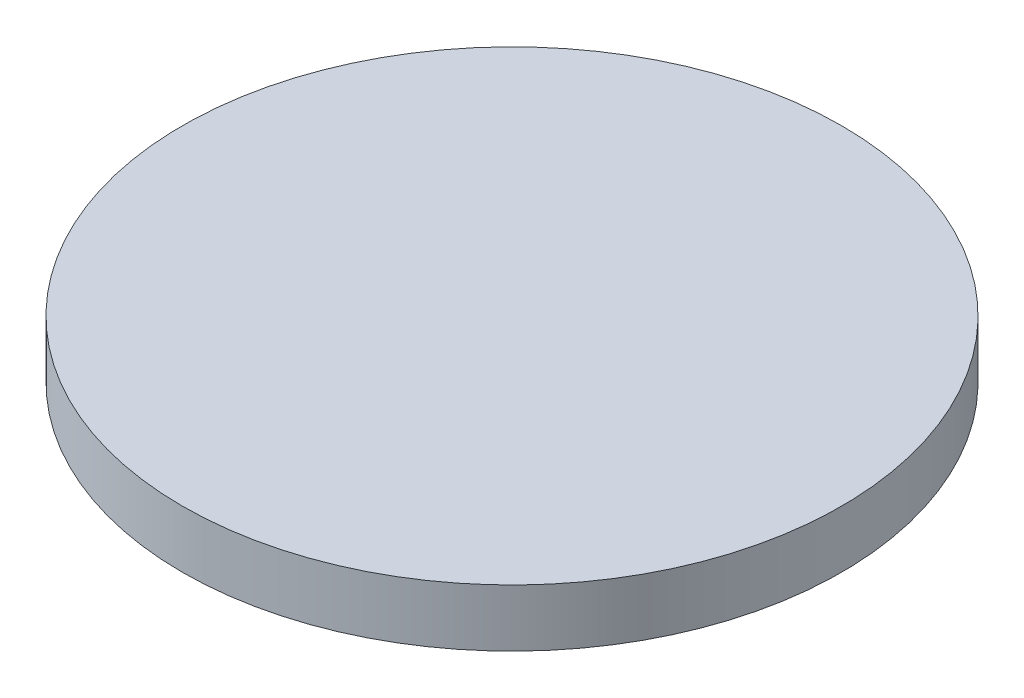
ISO-10303-21;
HEADER;
FILE_DESCRIPTION(('STEP AP214'),'2;1');
FILE_NAME('part.step','',(''),(''),'','','');
FILE_SCHEMA(('AUTOMOTIVE_DESIGN { 1 0 10303 214 1 1 1 1 }'));
ENDSEC;
DATA;
#1=APPLICATION_CONTEXT('core data for automotive mechanical design processes');
#2=APPLICATION_PROTOCOL_DEFINITION('international standard','automotive_design',2000,#1);
#3=PRODUCT_CONTEXT('',#1,'mechanical');
#4=PRODUCT('Part','Part','',(#3));
#5=PRODUCT_RELATED_PRODUCT_CATEGORY('part','',(#4));
#6=PRODUCT_DEFINITION_FORMATION('','',#4);
#7=PRODUCT_DEFINITION_CONTEXT('part definition',#1,'design');
#8=PRODUCT_DEFINITION('design','',#6,#7);
#9=PRODUCT_DEFINITION_SHAPE('','',#8);
#10=(LENGTH_UNIT() NAMED_UNIT(*) SI_UNIT(.MILLI.,.METRE.));
#11=(NAMED_UNIT(*) PLANE_ANGLE_UNIT() SI_UNIT($,.RADIAN.));
#12=(NAMED_UNIT(*) SI_UNIT($,.STERADIAN.) SOLID_ANGLE_UNIT());
#13=UNCERTAINTY_MEASURE_WITH_UNIT(LENGTH_MEASURE(1.E-05),#10,'distance_accuracy_value','');
#14=(GEOMETRIC_REPRESENTATION_CONTEXT(3) GLOBAL_UNCERTAINTY_ASSIGNED_CONTEXT((#13)) GLOBAL_UNIT_ASSIGNED_CONTEXT((#10,
#11,#12)) REPRESENTATION_CONTEXT('',''));
#15=CARTESIAN_POINT('',(0.,0.,0.));
#16=DIRECTION('',(0.,0.,1.));
#17=DIRECTION('',(1.,0.,0.));
#18=AXIS2_PLACEMENT_3D('',#15,#16,#17);
#19=CARTESIAN_POINT('',(0.,4.,0.));
#20=DIRECTION('',(0.,-1.,0.));
#21=DIRECTION('',(0.,0.,-1.));
#22=AXIS2_PLACEMENT_3D('',#19,#20,#21);
#23=CYLINDRICAL_SURFACE('',#22,23.);
#24=CARTESIAN_POINT('',(0.,4.,0.));
#25=DIRECTION('',(0.,1.,0.));
#26=DIRECTION('',(0.,0.,1.));
#27=AXIS2_PLACEMENT_3D('',#24,#25,#26);
#28=CIRCLE('',#27,23.);
#29=CARTESIAN_POINT('',(0.,4.,23.));
#30=VERTEX_POINT('',#29);
#31=EDGE_CURVE('E10',#30,#30,#28,.T.);
#32=ORIENTED_EDGE('',*,*,#31,.F.);
#33=EDGE_LOOP('',(#32));
#34=FACE_BOUND('',#33,.T.);
#35=CARTESIAN_POINT('',(0.,0.,0.));
#36=DIRECTION('',(0.,1.,0.));
#37=DIRECTION('',(0.,0.,1.));
#38=AXIS2_PLACEMENT_3D('',#35,#36,#37);
#39=CIRCLE('',#38,23.);
#40=CARTESIAN_POINT('',(0.,0.,23.));
#41=VERTEX_POINT('',#40);
#42=EDGE_CURVE('E36',#41,#41,#39,.T.);
#43=ORIENTED_EDGE('',*,*,#42,.T.);
#44=EDGE_LOOP('',(#43));
#45=FACE_BOUND('',#44,.T.);
#46=ADVANCED_FACE('F33',(#34,#45),#23,.T.);
#47=CARTESIAN_POINT('',(0.,4.,0.));
#48=DIRECTION('',(0.,1.,0.));
#49=DIRECTION('',(0.,0.,1.));
#50=AXIS2_PLACEMENT_3D('',#47,#48,#49);
#51=PLANE('',#50);
#52=ORIENTED_EDGE('',*,*,#31,.T.);
#53=EDGE_LOOP('',(#52));
#54=FACE_BOUND('',#53,.T.);
#55=ADVANCED_FACE('F48',(#54),#51,.T.);
#56=CARTESIAN_POINT('',(0.,0.,0.));
#57=DIRECTION('',(0.,1.,0.));
#58=DIRECTION('',(0.,0.,1.));
#59=AXIS2_PLACEMENT_3D('',#56,#57,#58);
#60=PLANE('',#59);
#61=ORIENTED_EDGE('',*,*,#42,.F.);
#62=EDGE_LOOP('',(#61));
#63=FACE_BOUND('',#62,.T.);
#64=ADVANCED_FACE('F46',(#63),#60,.F.);
#65=CLOSED_SHELL('',(#46,#55,#64));
#66=MANIFOLD_SOLID_BREP('B2',#65);
#67=ADVANCED_BREP_SHAPE_REPRESENTATION('',(#18,#66),#14);
#68=SHAPE_DEFINITION_REPRESENTATION(#9,#67);
ENDSEC;
END-ISO-10303-21;
